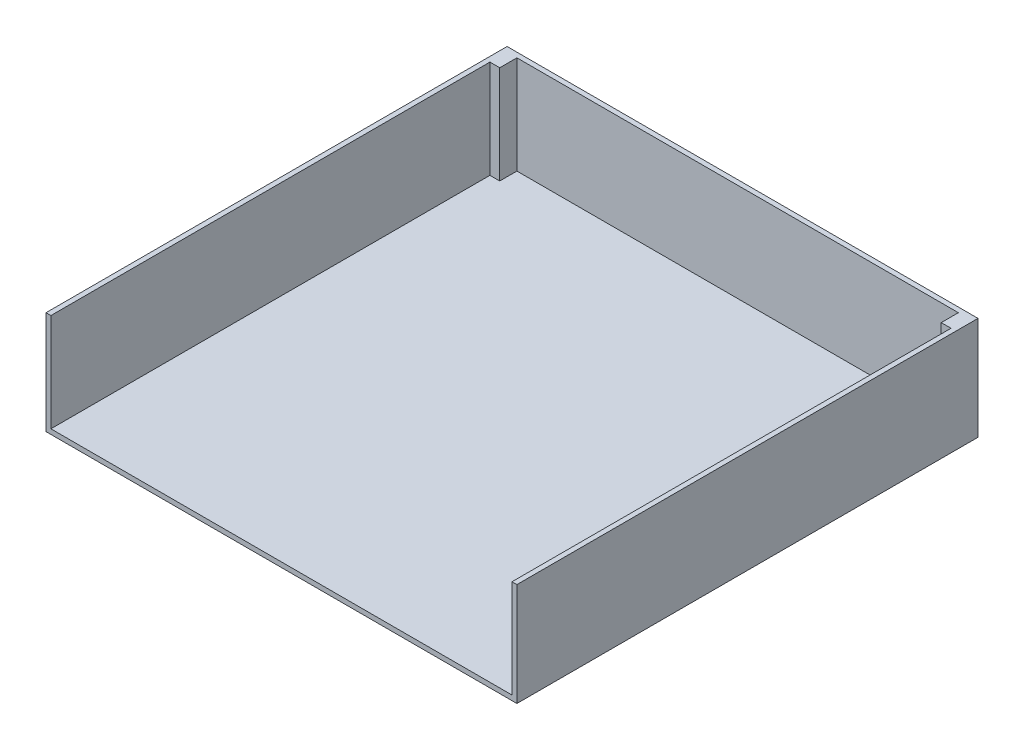
ISO-10303-21;
HEADER;
FILE_DESCRIPTION(('STEP AP214'),'2;1');
FILE_NAME('part.step','',(''),(''),'','','');
FILE_SCHEMA(('AUTOMOTIVE_DESIGN { 1 0 10303 214 1 1 1 1 }'));
ENDSEC;
DATA;
#1=APPLICATION_CONTEXT('core data for automotive mechanical design processes');
#2=APPLICATION_PROTOCOL_DEFINITION('international standard','automotive_design',2000,#1);
#3=PRODUCT_CONTEXT('',#1,'mechanical');
#4=PRODUCT('Part','Part','',(#3));
#5=PRODUCT_RELATED_PRODUCT_CATEGORY('part','',(#4));
#6=PRODUCT_DEFINITION_FORMATION('','',#4);
#7=PRODUCT_DEFINITION_CONTEXT('part definition',#1,'design');
#8=PRODUCT_DEFINITION('design','',#6,#7);
#9=PRODUCT_DEFINITION_SHAPE('','',#8);
#10=(LENGTH_UNIT() NAMED_UNIT(*) SI_UNIT(.MILLI.,.METRE.));
#11=(NAMED_UNIT(*) PLANE_ANGLE_UNIT() SI_UNIT($,.RADIAN.));
#12=(NAMED_UNIT(*) SI_UNIT($,.STERADIAN.) SOLID_ANGLE_UNIT());
#13=UNCERTAINTY_MEASURE_WITH_UNIT(LENGTH_MEASURE(1.E-05),#10,'distance_accuracy_value','');
#14=(GEOMETRIC_REPRESENTATION_CONTEXT(3) GLOBAL_UNCERTAINTY_ASSIGNED_CONTEXT((#13)) GLOBAL_UNIT_ASSIGNED_CONTEXT((#10,
#11,#12)) REPRESENTATION_CONTEXT('',''));
#15=CARTESIAN_POINT('',(0.,0.,0.));
#16=DIRECTION('',(0.,0.,1.));
#17=DIRECTION('',(1.,0.,0.));
#18=AXIS2_PLACEMENT_3D('',#15,#16,#17);
#19=CARTESIAN_POINT('',(-596.9,254.,-584.2));
#20=DIRECTION('',(0.,0.,-1.));
#21=DIRECTION('',(-1.,0.,0.));
#22=AXIS2_PLACEMENT_3D('',#19,#20,#21);
#23=PLANE('',#22);
#24=DIRECTION('',(0.,-1.,0.));
#25=VECTOR('',#24,1.);
#26=CARTESIAN_POINT('',(571.5,254.,-584.2));
#27=LINE('',#26,#25);
#28=CARTESIAN_POINT('',(571.5,254.,-584.2));
#29=VERTEX_POINT('',#28);
#30=CARTESIAN_POINT('',(571.5,0.,-584.2));
#31=VERTEX_POINT('',#30);
#32=EDGE_CURVE('E126',#29,#31,#27,.T.);
#33=ORIENTED_EDGE('',*,*,#32,.F.);
#34=DIRECTION('',(1.,0.,0.));
#35=VECTOR('',#34,1.);
#36=CARTESIAN_POINT('',(-596.9,254.,-584.2));
#37=LINE('',#36,#35);
#38=CARTESIAN_POINT('',(-571.5,254.,-584.2));
#39=VERTEX_POINT('',#38);
#40=EDGE_CURVE('E48',#39,#29,#37,.T.);
#41=ORIENTED_EDGE('',*,*,#40,.F.);
#42=DIRECTION('',(0.,-1.,0.));
#43=VECTOR('',#42,1.);
#44=CARTESIAN_POINT('',(-571.5,254.,-584.2));
#45=LINE('',#44,#43);
#46=CARTESIAN_POINT('',(-571.5,0.,-584.2));
#47=VERTEX_POINT('',#46);
#48=EDGE_CURVE('E271',#39,#47,#45,.T.);
#49=ORIENTED_EDGE('',*,*,#48,.T.);
#50=DIRECTION('',(1.,0.,0.));
#51=VECTOR('',#50,1.);
#52=CARTESIAN_POINT('',(-596.9,0.,-584.2));
#53=LINE('',#52,#51);
#54=EDGE_CURVE('E136',#47,#31,#53,.T.);
#55=ORIENTED_EDGE('',*,*,#54,.T.);
#56=EDGE_LOOP('',(#33,#41,#49,#55));
#57=FACE_BOUND('',#56,.T.);
#58=ADVANCED_FACE('F33',(#57),#23,.F.);
#59=CARTESIAN_POINT('',(0.,0.,0.));
#60=DIRECTION('',(0.,-1.,0.));
#61=DIRECTION('',(0.,0.,-1.));
#62=AXIS2_PLACEMENT_3D('',#59,#60,#61);
#63=PLANE('',#62);
#64=DIRECTION('',(0.,0.,1.));
#65=VECTOR('',#64,1.);
#66=CARTESIAN_POINT('',(571.5,0.,-584.2));
#67=LINE('',#66,#65);
#68=CARTESIAN_POINT('',(571.5,0.,-539.75));
#69=VERTEX_POINT('',#68);
#70=EDGE_CURVE('E256',#31,#69,#67,.T.);
#71=ORIENTED_EDGE('',*,*,#70,.F.);
#72=ORIENTED_EDGE('',*,*,#54,.F.);
#73=DIRECTION('',(0.,0.,-1.));
#74=VECTOR('',#73,1.);
#75=CARTESIAN_POINT('',(-571.5,0.,-584.2));
#76=LINE('',#75,#74);
#77=CARTESIAN_POINT('',(-571.5,0.,-539.75));
#78=VERTEX_POINT('',#77);
#79=EDGE_CURVE('E269',#78,#47,#76,.T.);
#80=ORIENTED_EDGE('',*,*,#79,.F.);
#81=DIRECTION('',(1.,0.,0.));
#82=VECTOR('',#81,1.);
#83=CARTESIAN_POINT('',(-596.9,0.,-539.75));
#84=LINE('',#83,#82);
#85=CARTESIAN_POINT('',(-596.9,0.,-539.75));
#86=VERTEX_POINT('',#85);
#87=EDGE_CURVE('E137',#86,#78,#84,.T.);
#88=ORIENTED_EDGE('',*,*,#87,.F.);
#89=DIRECTION('',(0.,0.,-1.));
#90=VECTOR('',#89,1.);
#91=CARTESIAN_POINT('',(-596.9,0.,584.2));
#92=LINE('',#91,#90);
#93=CARTESIAN_POINT('',(-596.9,0.,596.9));
#94=VERTEX_POINT('',#93);
#95=EDGE_CURVE('E154',#94,#86,#92,.T.);
#96=ORIENTED_EDGE('',*,*,#95,.F.);
#97=DIRECTION('',(-1.,0.,0.));
#98=VECTOR('',#97,1.);
#99=CARTESIAN_POINT('',(609.6,0.,596.9));
#100=LINE('',#99,#98);
#101=CARTESIAN_POINT('',(596.9,0.,596.9));
#102=VERTEX_POINT('',#101);
#103=EDGE_CURVE('E194',#102,#94,#100,.T.);
#104=ORIENTED_EDGE('',*,*,#103,.F.);
#105=DIRECTION('',(0.,0.,1.));
#106=VECTOR('',#105,1.);
#107=CARTESIAN_POINT('',(596.9,0.,584.2));
#108=LINE('',#107,#106);
#109=CARTESIAN_POINT('',(596.9,0.,-539.75));
#110=VERTEX_POINT('',#109);
#111=EDGE_CURVE('E158',#110,#102,#108,.T.);
#112=ORIENTED_EDGE('',*,*,#111,.F.);
#113=DIRECTION('',(1.,0.,0.));
#114=VECTOR('',#113,1.);
#115=CARTESIAN_POINT('',(596.9,0.,-539.75));
#116=LINE('',#115,#114);
#117=EDGE_CURVE('E133',#69,#110,#116,.T.);
#118=ORIENTED_EDGE('',*,*,#117,.F.);
#119=EDGE_LOOP('',(#71,#72,#80,#88,#96,#104,#112,#118));
#120=FACE_BOUND('',#119,.T.);
#121=ADVANCED_FACE('F217',(#120),#63,.F.);
#122=CARTESIAN_POINT('',(596.9,254.,584.2));
#123=DIRECTION('',(1.,0.,0.));
#124=DIRECTION('',(0.,0.,-1.));
#125=AXIS2_PLACEMENT_3D('',#122,#123,#124);
#126=PLANE('',#125);
#127=DIRECTION('',(0.,-1.,0.));
#128=VECTOR('',#127,1.);
#129=CARTESIAN_POINT('',(596.9,254.,-539.75));
#130=LINE('',#129,#128);
#131=CARTESIAN_POINT('',(596.9,254.,-539.75));
#132=VERTEX_POINT('',#131);
#133=EDGE_CURVE('E253',#132,#110,#130,.T.);
#134=ORIENTED_EDGE('',*,*,#133,.T.);
#135=ORIENTED_EDGE('',*,*,#111,.T.);
#136=DIRECTION('',(0.,-1.,0.));
#137=VECTOR('',#136,1.);
#138=CARTESIAN_POINT('',(596.9,254.,596.9));
#139=LINE('',#138,#137);
#140=CARTESIAN_POINT('',(596.9,254.,596.9));
#141=VERTEX_POINT('',#140);
#142=EDGE_CURVE('E162',#141,#102,#139,.T.);
#143=ORIENTED_EDGE('',*,*,#142,.F.);
#144=DIRECTION('',(0.,0.,1.));
#145=VECTOR('',#144,1.);
#146=CARTESIAN_POINT('',(596.9,254.,584.2));
#147=LINE('',#146,#145);
#148=EDGE_CURVE('E143',#132,#141,#147,.T.);
#149=ORIENTED_EDGE('',*,*,#148,.F.);
#150=EDGE_LOOP('',(#134,#135,#143,#149));
#151=FACE_BOUND('',#150,.T.);
#152=ADVANCED_FACE('F210',(#151),#126,.F.);
#153=CARTESIAN_POINT('',(-596.9,254.,584.2));
#154=DIRECTION('',(-1.,0.,0.));
#155=DIRECTION('',(0.,0.,1.));
#156=AXIS2_PLACEMENT_3D('',#153,#154,#155);
#157=PLANE('',#156);
#158=DIRECTION('',(0.,-1.,0.));
#159=VECTOR('',#158,1.);
#160=CARTESIAN_POINT('',(-596.9,254.,-539.75));
#161=LINE('',#160,#159);
#162=CARTESIAN_POINT('',(-596.9,254.,-539.749999999999));
#163=VERTEX_POINT('',#162);
#164=EDGE_CURVE('E56',#163,#86,#161,.T.);
#165=ORIENTED_EDGE('',*,*,#164,.F.);
#166=DIRECTION('',(0.,0.,-1.));
#167=VECTOR('',#166,1.);
#168=CARTESIAN_POINT('',(-596.9,254.,584.2));
#169=LINE('',#168,#167);
#170=CARTESIAN_POINT('',(-596.9,254.,596.9));
#171=VERTEX_POINT('',#170);
#172=EDGE_CURVE('E144',#171,#163,#169,.T.);
#173=ORIENTED_EDGE('',*,*,#172,.F.);
#174=DIRECTION('',(0.,-1.,0.));
#175=VECTOR('',#174,1.);
#176=CARTESIAN_POINT('',(-596.9,254.,596.9));
#177=LINE('',#176,#175);
#178=EDGE_CURVE('E165',#171,#94,#177,.T.);
#179=ORIENTED_EDGE('',*,*,#178,.T.);
#180=ORIENTED_EDGE('',*,*,#95,.T.);
#181=EDGE_LOOP('',(#165,#173,#179,#180));
#182=FACE_BOUND('',#181,.T.);
#183=ADVANCED_FACE('F208',(#182),#157,.F.);
#184=CARTESIAN_POINT('',(609.6,254.,596.9));
#185=DIRECTION('',(-1.,0.,0.));
#186=DIRECTION('',(0.,0.,1.));
#187=AXIS2_PLACEMENT_3D('',#184,#185,#186);
#188=PLANE('',#187);
#189=DIRECTION('',(0.,-1.,0.));
#190=VECTOR('',#189,1.);
#191=CARTESIAN_POINT('',(609.6,254.,596.9));
#192=LINE('',#191,#190);
#193=CARTESIAN_POINT('',(609.6,254.,596.9));
#194=VERTEX_POINT('',#193);
#195=CARTESIAN_POINT('',(609.6,-12.7,596.9));
#196=VERTEX_POINT('',#195);
#197=EDGE_CURVE('E153',#194,#196,#192,.T.);
#198=ORIENTED_EDGE('',*,*,#197,.T.);
#199=DIRECTION('',(0.,0.,1.));
#200=VECTOR('',#199,1.);
#201=CARTESIAN_POINT('',(609.6,-12.7,-596.9));
#202=LINE('',#201,#200);
#203=CARTESIAN_POINT('',(609.6,-12.7,-596.9));
#204=VERTEX_POINT('',#203);
#205=EDGE_CURVE('E197',#204,#196,#202,.T.);
#206=ORIENTED_EDGE('',*,*,#205,.F.);
#207=DIRECTION('',(0.,-1.,0.));
#208=VECTOR('',#207,1.);
#209=CARTESIAN_POINT('',(609.6,254.,-596.9));
#210=LINE('',#209,#208);
#211=CARTESIAN_POINT('',(609.6,254.,-596.9));
#212=VERTEX_POINT('',#211);
#213=EDGE_CURVE('E11',#212,#204,#210,.T.);
#214=ORIENTED_EDGE('',*,*,#213,.F.);
#215=DIRECTION('',(0.,0.,-1.));
#216=VECTOR('',#215,1.);
#217=CARTESIAN_POINT('',(609.6,254.,596.9));
#218=LINE('',#217,#216);
#219=EDGE_CURVE('E160',#194,#212,#218,.T.);
#220=ORIENTED_EDGE('',*,*,#219,.F.);
#221=EDGE_LOOP('',(#198,#206,#214,#220));
#222=FACE_BOUND('',#221,.T.);
#223=ADVANCED_FACE('F35',(#222),#188,.F.);
#224=CARTESIAN_POINT('',(-609.6,254.,-596.9));
#225=DIRECTION('',(0.,0.,1.));
#226=DIRECTION('',(1.,0.,0.));
#227=AXIS2_PLACEMENT_3D('',#224,#225,#226);
#228=PLANE('',#227);
#229=ORIENTED_EDGE('',*,*,#213,.T.);
#230=DIRECTION('',(1.,0.,0.));
#231=VECTOR('',#230,1.);
#232=CARTESIAN_POINT('',(609.6,-12.7,-596.9));
#233=LINE('',#232,#231);
#234=CARTESIAN_POINT('',(-609.6,-12.7,-596.9));
#235=VERTEX_POINT('',#234);
#236=EDGE_CURVE('E156',#235,#204,#233,.T.);
#237=ORIENTED_EDGE('',*,*,#236,.F.);
#238=DIRECTION('',(0.,-1.,0.));
#239=VECTOR('',#238,1.);
#240=CARTESIAN_POINT('',(-609.6,254.,-596.9));
#241=LINE('',#240,#239);
#242=CARTESIAN_POINT('',(-609.6,254.,-596.9));
#243=VERTEX_POINT('',#242);
#244=EDGE_CURVE('E41',#243,#235,#241,.T.);
#245=ORIENTED_EDGE('',*,*,#244,.F.);
#246=DIRECTION('',(-1.,0.,0.));
#247=VECTOR('',#246,1.);
#248=CARTESIAN_POINT('',(-609.6,254.,-596.9));
#249=LINE('',#248,#247);
#250=EDGE_CURVE('E200',#212,#243,#249,.T.);
#251=ORIENTED_EDGE('',*,*,#250,.F.);
#252=EDGE_LOOP('',(#229,#237,#245,#251));
#253=FACE_BOUND('',#252,.T.);
#254=ADVANCED_FACE('F189',(#253),#228,.F.);
#255=CARTESIAN_POINT('',(-609.6,254.,596.9));
#256=DIRECTION('',(1.,0.,0.));
#257=DIRECTION('',(0.,0.,-1.));
#258=AXIS2_PLACEMENT_3D('',#255,#256,#257);
#259=PLANE('',#258);
#260=ORIENTED_EDGE('',*,*,#244,.T.);
#261=DIRECTION('',(0.,0.,-1.));
#262=VECTOR('',#261,1.);
#263=CARTESIAN_POINT('',(-609.6,-12.7,-596.9));
#264=LINE('',#263,#262);
#265=CARTESIAN_POINT('',(-609.6,-12.7,596.9));
#266=VERTEX_POINT('',#265);
#267=EDGE_CURVE('E176',#266,#235,#264,.T.);
#268=ORIENTED_EDGE('',*,*,#267,.F.);
#269=DIRECTION('',(0.,-1.,0.));
#270=VECTOR('',#269,1.);
#271=CARTESIAN_POINT('',(-609.6,254.,596.9));
#272=LINE('',#271,#270);
#273=CARTESIAN_POINT('',(-609.6,254.,596.9));
#274=VERTEX_POINT('',#273);
#275=EDGE_CURVE('E168',#274,#266,#272,.T.);
#276=ORIENTED_EDGE('',*,*,#275,.F.);
#277=DIRECTION('',(0.,0.,1.));
#278=VECTOR('',#277,1.);
#279=CARTESIAN_POINT('',(-609.6,254.,596.9));
#280=LINE('',#279,#278);
#281=EDGE_CURVE('E177',#243,#274,#280,.T.);
#282=ORIENTED_EDGE('',*,*,#281,.F.);
#283=EDGE_LOOP('',(#260,#268,#276,#282));
#284=FACE_BOUND('',#283,.T.);
#285=ADVANCED_FACE('F174',(#284),#259,.F.);
#286=CARTESIAN_POINT('',(596.9,254.,596.9));
#287=DIRECTION('',(0.,0.,-1.));
#288=DIRECTION('',(-1.,0.,0.));
#289=AXIS2_PLACEMENT_3D('',#286,#287,#288);
#290=PLANE('',#289);
#291=ORIENTED_EDGE('',*,*,#142,.T.);
#292=ORIENTED_EDGE('',*,*,#103,.T.);
#293=ORIENTED_EDGE('',*,*,#178,.F.);
#294=DIRECTION('',(1.,0.,0.));
#295=VECTOR('',#294,1.);
#296=CARTESIAN_POINT('',(-609.6,254.,596.9));
#297=LINE('',#296,#295);
#298=EDGE_CURVE('E148',#274,#171,#297,.T.);
#299=ORIENTED_EDGE('',*,*,#298,.F.);
#300=ORIENTED_EDGE('',*,*,#275,.T.);
#301=DIRECTION('',(-1.,0.,0.));
#302=VECTOR('',#301,1.);
#303=CARTESIAN_POINT('',(609.6,-12.7,596.9));
#304=LINE('',#303,#302);
#305=EDGE_CURVE('E187',#196,#266,#304,.T.);
#306=ORIENTED_EDGE('',*,*,#305,.F.);
#307=ORIENTED_EDGE('',*,*,#197,.F.);
#308=DIRECTION('',(1.,0.,0.));
#309=VECTOR('',#308,1.);
#310=CARTESIAN_POINT('',(596.9,254.,596.9));
#311=LINE('',#310,#309);
#312=EDGE_CURVE('E146',#141,#194,#311,.T.);
#313=ORIENTED_EDGE('',*,*,#312,.F.);
#314=EDGE_LOOP('',(#291,#292,#293,#299,#300,#306,#307,#313));
#315=FACE_BOUND('',#314,.T.);
#316=ADVANCED_FACE('F206',(#315),#290,.F.);
#317=CARTESIAN_POINT('',(0.,254.,0.));
#318=DIRECTION('',(0.,-1.,0.));
#319=DIRECTION('',(0.,0.,-1.));
#320=AXIS2_PLACEMENT_3D('',#317,#318,#319);
#321=PLANE('',#320);
#322=DIRECTION('',(1.,0.,0.));
#323=VECTOR('',#322,1.);
#324=CARTESIAN_POINT('',(596.9,254.,-539.75));
#325=LINE('',#324,#323);
#326=CARTESIAN_POINT('',(571.5,254.,-539.75));
#327=VERTEX_POINT('',#326);
#328=EDGE_CURVE('E132',#327,#132,#325,.T.);
#329=ORIENTED_EDGE('',*,*,#328,.T.);
#330=ORIENTED_EDGE('',*,*,#148,.T.);
#331=ORIENTED_EDGE('',*,*,#312,.T.);
#332=ORIENTED_EDGE('',*,*,#219,.T.);
#333=ORIENTED_EDGE('',*,*,#250,.T.);
#334=ORIENTED_EDGE('',*,*,#281,.T.);
#335=ORIENTED_EDGE('',*,*,#298,.T.);
#336=ORIENTED_EDGE('',*,*,#172,.T.);
#337=DIRECTION('',(1.,0.,0.));
#338=VECTOR('',#337,1.);
#339=CARTESIAN_POINT('',(-596.9,254.,-539.75));
#340=LINE('',#339,#338);
#341=CARTESIAN_POINT('',(-571.5,254.,-539.75));
#342=VERTEX_POINT('',#341);
#343=EDGE_CURVE('E267',#163,#342,#340,.T.);
#344=ORIENTED_EDGE('',*,*,#343,.T.);
#345=DIRECTION('',(0.,0.,-1.));
#346=VECTOR('',#345,1.);
#347=CARTESIAN_POINT('',(-571.5,254.,-584.2));
#348=LINE('',#347,#346);
#349=EDGE_CURVE('E141',#342,#39,#348,.T.);
#350=ORIENTED_EDGE('',*,*,#349,.T.);
#351=ORIENTED_EDGE('',*,*,#40,.T.);
#352=DIRECTION('',(0.,0.,1.));
#353=VECTOR('',#352,1.);
#354=CARTESIAN_POINT('',(571.5,254.,-584.2));
#355=LINE('',#354,#353);
#356=EDGE_CURVE('E124',#29,#327,#355,.T.);
#357=ORIENTED_EDGE('',*,*,#356,.T.);
#358=EDGE_LOOP('',(#329,#330,#331,#332,#333,#334,#335,#336,#344,#350,#351,#357));
#359=FACE_BOUND('',#358,.T.);
#360=ADVANCED_FACE('F139',(#359),#321,.F.);
#361=CARTESIAN_POINT('',(0.,-12.7,0.));
#362=DIRECTION('',(0.,-1.,0.));
#363=DIRECTION('',(0.,0.,-1.));
#364=AXIS2_PLACEMENT_3D('',#361,#362,#363);
#365=PLANE('',#364);
#366=ORIENTED_EDGE('',*,*,#205,.T.);
#367=ORIENTED_EDGE('',*,*,#305,.T.);
#368=ORIENTED_EDGE('',*,*,#267,.T.);
#369=ORIENTED_EDGE('',*,*,#236,.T.);
#370=EDGE_LOOP('',(#366,#367,#368,#369));
#371=FACE_BOUND('',#370,.T.);
#372=ADVANCED_FACE('F184',(#371),#365,.T.);
#373=CARTESIAN_POINT('',(-596.9,254.,-539.75));
#374=DIRECTION('',(0.,0.,-1.));
#375=DIRECTION('',(-1.,0.,0.));
#376=AXIS2_PLACEMENT_3D('',#373,#374,#375);
#377=PLANE('',#376);
#378=ORIENTED_EDGE('',*,*,#87,.T.);
#379=DIRECTION('',(0.,-1.,0.));
#380=VECTOR('',#379,1.);
#381=CARTESIAN_POINT('',(-571.5,254.,-539.75));
#382=LINE('',#381,#380);
#383=EDGE_CURVE('E277',#342,#78,#382,.T.);
#384=ORIENTED_EDGE('',*,*,#383,.F.);
#385=ORIENTED_EDGE('',*,*,#343,.F.);
#386=ORIENTED_EDGE('',*,*,#164,.T.);
#387=EDGE_LOOP('',(#378,#384,#385,#386));
#388=FACE_BOUND('',#387,.T.);
#389=ADVANCED_FACE('F235',(#388),#377,.F.);
#390=CARTESIAN_POINT('',(-571.5,254.,-584.2));
#391=DIRECTION('',(-1.,0.,0.));
#392=DIRECTION('',(0.,0.,1.));
#393=AXIS2_PLACEMENT_3D('',#390,#391,#392);
#394=PLANE('',#393);
#395=ORIENTED_EDGE('',*,*,#79,.T.);
#396=ORIENTED_EDGE('',*,*,#48,.F.);
#397=ORIENTED_EDGE('',*,*,#349,.F.);
#398=ORIENTED_EDGE('',*,*,#383,.T.);
#399=EDGE_LOOP('',(#395,#396,#397,#398));
#400=FACE_BOUND('',#399,.T.);
#401=ADVANCED_FACE('F238',(#400),#394,.F.);
#402=CARTESIAN_POINT('',(571.5,254.,-584.2));
#403=DIRECTION('',(1.,0.,0.));
#404=DIRECTION('',(0.,0.,-1.));
#405=AXIS2_PLACEMENT_3D('',#402,#403,#404);
#406=PLANE('',#405);
#407=ORIENTED_EDGE('',*,*,#70,.T.);
#408=DIRECTION('',(0.,-1.,0.));
#409=VECTOR('',#408,1.);
#410=CARTESIAN_POINT('',(571.5,254.,-539.75));
#411=LINE('',#410,#409);
#412=EDGE_CURVE('E129',#327,#69,#411,.T.);
#413=ORIENTED_EDGE('',*,*,#412,.F.);
#414=ORIENTED_EDGE('',*,*,#356,.F.);
#415=ORIENTED_EDGE('',*,*,#32,.T.);
#416=EDGE_LOOP('',(#407,#413,#414,#415));
#417=FACE_BOUND('',#416,.T.);
#418=ADVANCED_FACE('F125',(#417),#406,.F.);
#419=CARTESIAN_POINT('',(596.9,254.,-539.75));
#420=DIRECTION('',(0.,0.,-1.));
#421=DIRECTION('',(-1.,0.,0.));
#422=AXIS2_PLACEMENT_3D('',#419,#420,#421);
#423=PLANE('',#422);
#424=ORIENTED_EDGE('',*,*,#117,.T.);
#425=ORIENTED_EDGE('',*,*,#133,.F.);
#426=ORIENTED_EDGE('',*,*,#328,.F.);
#427=ORIENTED_EDGE('',*,*,#412,.T.);
#428=EDGE_LOOP('',(#424,#425,#426,#427));
#429=FACE_BOUND('',#428,.T.);
#430=ADVANCED_FACE('F245',(#429),#423,.F.);
#431=CLOSED_SHELL('',(#58,#121,#152,#183,#223,#254,#285,#316,#360,#372,#389,#401,#418,#430));
#432=MANIFOLD_SOLID_BREP('B2',#431);
#433=ADVANCED_BREP_SHAPE_REPRESENTATION('',(#18,#432),#14);
#434=SHAPE_DEFINITION_REPRESENTATION(#9,#433);
ENDSEC;
END-ISO-10303-21;
